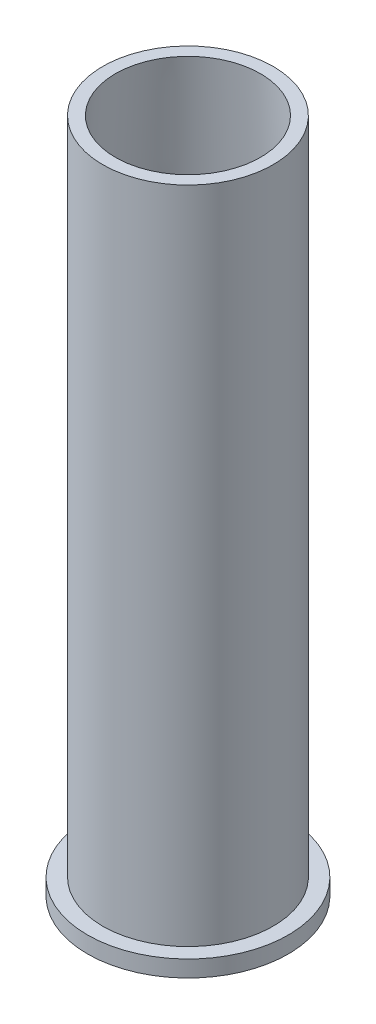
ISO-10303-21;
HEADER;
FILE_DESCRIPTION(('STEP AP214'),'2;1');
FILE_NAME('part.step','',(''),(''),'','','');
FILE_SCHEMA(('AUTOMOTIVE_DESIGN { 1 0 10303 214 1 1 1 1 }'));
ENDSEC;
DATA;
#1=APPLICATION_CONTEXT('core data for automotive mechanical design processes');
#2=APPLICATION_PROTOCOL_DEFINITION('international standard','automotive_design',2000,#1);
#3=PRODUCT_CONTEXT('',#1,'mechanical');
#4=PRODUCT('Part','Part','',(#3));
#5=PRODUCT_RELATED_PRODUCT_CATEGORY('part','',(#4));
#6=PRODUCT_DEFINITION_FORMATION('','',#4);
#7=PRODUCT_DEFINITION_CONTEXT('part definition',#1,'design');
#8=PRODUCT_DEFINITION('design','',#6,#7);
#9=PRODUCT_DEFINITION_SHAPE('','',#8);
#10=(LENGTH_UNIT() NAMED_UNIT(*) SI_UNIT(.MILLI.,.METRE.));
#11=(NAMED_UNIT(*) PLANE_ANGLE_UNIT() SI_UNIT($,.RADIAN.));
#12=(NAMED_UNIT(*) SI_UNIT($,.STERADIAN.) SOLID_ANGLE_UNIT());
#13=UNCERTAINTY_MEASURE_WITH_UNIT(LENGTH_MEASURE(1.E-05),#10,'distance_accuracy_value','');
#14=(GEOMETRIC_REPRESENTATION_CONTEXT(3) GLOBAL_UNCERTAINTY_ASSIGNED_CONTEXT((#13)) GLOBAL_UNIT_ASSIGNED_CONTEXT((#10,
#11,#12)) REPRESENTATION_CONTEXT('',''));
#15=CARTESIAN_POINT('',(0.,0.,0.));
#16=DIRECTION('',(0.,0.,1.));
#17=DIRECTION('',(1.,0.,0.));
#18=AXIS2_PLACEMENT_3D('',#15,#16,#17);
#19=CARTESIAN_POINT('',(0.,3.,0.));
#20=DIRECTION('',(0.,-1.,0.));
#21=DIRECTION('',(0.,0.,-1.));
#22=AXIS2_PLACEMENT_3D('',#19,#20,#21);
#23=CYLINDRICAL_SURFACE('',#22,18.2625);
#24=CARTESIAN_POINT('',(0.,3.,0.));
#25=DIRECTION('',(0.,1.,0.));
#26=DIRECTION('',(0.,0.,1.));
#27=AXIS2_PLACEMENT_3D('',#24,#25,#26);
#28=CIRCLE('',#27,18.2625);
#29=CARTESIAN_POINT('',(0.,3.,18.2625));
#30=VERTEX_POINT('',#29);
#31=EDGE_CURVE('E51',#30,#30,#28,.T.);
#32=ORIENTED_EDGE('',*,*,#31,.F.);
#33=EDGE_LOOP('',(#32));
#34=FACE_BOUND('',#33,.T.);
#35=CARTESIAN_POINT('',(0.,0.,0.));
#36=DIRECTION('',(0.,1.,0.));
#37=DIRECTION('',(0.,0.,1.));
#38=AXIS2_PLACEMENT_3D('',#35,#36,#37);
#39=CIRCLE('',#38,18.2625);
#40=CARTESIAN_POINT('',(0.,0.,18.2625));
#41=VERTEX_POINT('',#40);
#42=EDGE_CURVE('E46',#41,#41,#39,.T.);
#43=ORIENTED_EDGE('',*,*,#42,.T.);
#44=EDGE_LOOP('',(#43));
#45=FACE_BOUND('',#44,.T.);
#46=ADVANCED_FACE('F43',(#34,#45),#23,.T.);
#47=CARTESIAN_POINT('',(0.,3.,0.));
#48=DIRECTION('',(0.,1.,0.));
#49=DIRECTION('',(0.,0.,1.));
#50=AXIS2_PLACEMENT_3D('',#47,#48,#49);
#51=PLANE('',#50);
#52=CARTESIAN_POINT('',(0.,3.,0.));
#53=DIRECTION('',(0.,1.,0.));
#54=DIRECTION('',(0.,0.,1.));
#55=AXIS2_PLACEMENT_3D('',#52,#53,#54);
#56=CIRCLE('',#55,15.5);
#57=CARTESIAN_POINT('',(0.,3.,15.5));
#58=VERTEX_POINT('',#57);
#59=EDGE_CURVE('E10',#58,#58,#56,.T.);
#60=ORIENTED_EDGE('',*,*,#59,.F.);
#61=EDGE_LOOP('',(#60));
#62=FACE_BOUND('',#61,.T.);
#63=ORIENTED_EDGE('',*,*,#31,.T.);
#64=EDGE_LOOP('',(#63));
#65=FACE_BOUND('',#64,.T.);
#66=ADVANCED_FACE('F92',(#62,#65),#51,.T.);
#67=CARTESIAN_POINT('',(0.,0.,0.));
#68=DIRECTION('',(0.,1.,0.));
#69=DIRECTION('',(0.,0.,1.));
#70=AXIS2_PLACEMENT_3D('',#67,#68,#69);
#71=PLANE('',#70);
#72=CARTESIAN_POINT('',(0.,0.,0.));
#73=DIRECTION('',(0.,-1.,0.));
#74=DIRECTION('',(0.,0.,-1.));
#75=AXIS2_PLACEMENT_3D('',#72,#73,#74);
#76=CIRCLE('',#75,14.75);
#77=CARTESIAN_POINT('',(0.,0.,-14.75));
#78=VERTEX_POINT('',#77);
#79=EDGE_CURVE('E62',#78,#78,#76,.T.);
#80=ORIENTED_EDGE('',*,*,#79,.F.);
#81=EDGE_LOOP('',(#80));
#82=FACE_BOUND('',#81,.T.);
#83=ORIENTED_EDGE('',*,*,#42,.F.);
#84=EDGE_LOOP('',(#83));
#85=FACE_BOUND('',#84,.T.);
#86=ADVANCED_FACE('F86',(#82,#85),#71,.F.);
#87=CARTESIAN_POINT('',(0.,123.,0.));
#88=DIRECTION('',(0.,-1.,0.));
#89=DIRECTION('',(0.,0.,-1.));
#90=AXIS2_PLACEMENT_3D('',#87,#88,#89);
#91=CYLINDRICAL_SURFACE('',#90,15.5);
#92=CARTESIAN_POINT('',(0.,123.,0.));
#93=DIRECTION('',(0.,1.,0.));
#94=DIRECTION('',(0.,0.,1.));
#95=AXIS2_PLACEMENT_3D('',#92,#93,#94);
#96=CIRCLE('',#95,15.5);
#97=CARTESIAN_POINT('',(0.,123.,15.5));
#98=VERTEX_POINT('',#97);
#99=EDGE_CURVE('E58',#98,#98,#96,.T.);
#100=ORIENTED_EDGE('',*,*,#99,.F.);
#101=EDGE_LOOP('',(#100));
#102=FACE_BOUND('',#101,.T.);
#103=ORIENTED_EDGE('',*,*,#59,.T.);
#104=EDGE_LOOP('',(#103));
#105=FACE_BOUND('',#104,.T.);
#106=ADVANCED_FACE('F81',(#102,#105),#91,.T.);
#107=CARTESIAN_POINT('',(0.,123.,0.));
#108=DIRECTION('',(0.,1.,0.));
#109=DIRECTION('',(0.,0.,1.));
#110=AXIS2_PLACEMENT_3D('',#107,#108,#109);
#111=PLANE('',#110);
#112=CARTESIAN_POINT('',(0.,123.,0.));
#113=DIRECTION('',(0.,1.,0.));
#114=DIRECTION('',(-1.,0.,0.));
#115=AXIS2_PLACEMENT_3D('',#112,#113,#114);
#116=CIRCLE('',#115,13.2);
#117=CARTESIAN_POINT('',(-13.2,123.,0.));
#118=VERTEX_POINT('',#117);
#119=EDGE_CURVE('E70',#118,#118,#116,.T.);
#120=ORIENTED_EDGE('',*,*,#119,.F.);
#121=EDGE_LOOP('',(#120));
#122=FACE_BOUND('',#121,.T.);
#123=ORIENTED_EDGE('',*,*,#99,.T.);
#124=EDGE_LOOP('',(#123));
#125=FACE_BOUND('',#124,.T.);
#126=ADVANCED_FACE('F77',(#122,#125),#111,.T.);
#127=CARTESIAN_POINT('',(0.,102.,0.));
#128=DIRECTION('',(0.,-1.,0.));
#129=DIRECTION('',(0.,0.,-1.));
#130=AXIS2_PLACEMENT_3D('',#127,#128,#129);
#131=CYLINDRICAL_SURFACE('',#130,14.75);
#132=CARTESIAN_POINT('',(0.,102.,0.));
#133=DIRECTION('',(0.,1.,0.));
#134=DIRECTION('',(-1.,0.,0.));
#135=AXIS2_PLACEMENT_3D('',#132,#133,#134);
#136=CIRCLE('',#135,14.75);
#137=CARTESIAN_POINT('',(-14.75,102.,0.));
#138=VERTEX_POINT('',#137);
#139=EDGE_CURVE('E66',#138,#138,#136,.T.);
#140=ORIENTED_EDGE('',*,*,#139,.T.);
#141=EDGE_LOOP('',(#140));
#142=FACE_BOUND('',#141,.T.);
#143=ORIENTED_EDGE('',*,*,#79,.T.);
#144=EDGE_LOOP('',(#143));
#145=FACE_BOUND('',#144,.T.);
#146=ADVANCED_FACE('F80',(#142,#145),#131,.F.);
#147=CARTESIAN_POINT('',(0.,123.,0.));
#148=DIRECTION('',(0.,-1.,0.));
#149=DIRECTION('',(1.,0.,0.));
#150=AXIS2_PLACEMENT_3D('',#147,#148,#149);
#151=CONICAL_SURFACE('',#150,13.2,0.0736759259292284);
#152=ORIENTED_EDGE('',*,*,#139,.F.);
#153=EDGE_LOOP('',(#152));
#154=FACE_BOUND('',#153,.T.);
#155=ORIENTED_EDGE('',*,*,#119,.T.);
#156=EDGE_LOOP('',(#155));
#157=FACE_BOUND('',#156,.T.);
#158=ADVANCED_FACE('F75',(#154,#157),#151,.F.);
#159=CLOSED_SHELL('',(#46,#66,#86,#106,#126,#146,#158));
#160=MANIFOLD_SOLID_BREP('B2',#159);
#161=ADVANCED_BREP_SHAPE_REPRESENTATION('',(#18,#160),#14);
#162=SHAPE_DEFINITION_REPRESENTATION(#9,#161);
ENDSEC;
END-ISO-10303-21;
